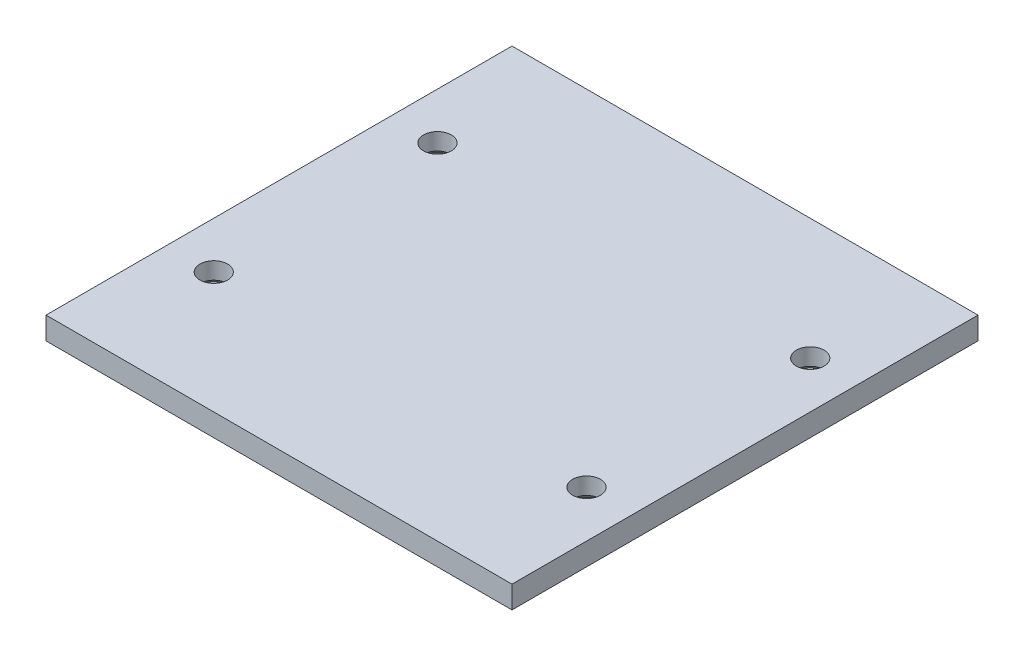
ISO-10303-21;
HEADER;
FILE_DESCRIPTION(('STEP AP214'),'2;1');
FILE_NAME('part.step','',(''),(''),'','','');
FILE_SCHEMA(('AUTOMOTIVE_DESIGN { 1 0 10303 214 1 1 1 1 }'));
ENDSEC;
DATA;
#1=APPLICATION_CONTEXT('core data for automotive mechanical design processes');
#2=APPLICATION_PROTOCOL_DEFINITION('international standard','automotive_design',2000,#1);
#3=PRODUCT_CONTEXT('',#1,'mechanical');
#4=PRODUCT('Part','Part','',(#3));
#5=PRODUCT_RELATED_PRODUCT_CATEGORY('part','',(#4));
#6=PRODUCT_DEFINITION_FORMATION('','',#4);
#7=PRODUCT_DEFINITION_CONTEXT('part definition',#1,'design');
#8=PRODUCT_DEFINITION('design','',#6,#7);
#9=PRODUCT_DEFINITION_SHAPE('','',#8);
#10=(LENGTH_UNIT() NAMED_UNIT(*) SI_UNIT(.MILLI.,.METRE.));
#11=(NAMED_UNIT(*) PLANE_ANGLE_UNIT() SI_UNIT($,.RADIAN.));
#12=(NAMED_UNIT(*) SI_UNIT($,.STERADIAN.) SOLID_ANGLE_UNIT());
#13=UNCERTAINTY_MEASURE_WITH_UNIT(LENGTH_MEASURE(1.E-05),#10,'distance_accuracy_value','');
#14=(GEOMETRIC_REPRESENTATION_CONTEXT(3) GLOBAL_UNCERTAINTY_ASSIGNED_CONTEXT((#13)) GLOBAL_UNIT_ASSIGNED_CONTEXT((#10,
#11,#12)) REPRESENTATION_CONTEXT('',''));
#15=CARTESIAN_POINT('',(0.,0.,0.));
#16=DIRECTION('',(0.,0.,1.));
#17=DIRECTION('',(1.,0.,0.));
#18=AXIS2_PLACEMENT_3D('',#15,#16,#17);
#19=CARTESIAN_POINT('',(0.,0.,0.));
#20=DIRECTION('',(0.,1.,0.));
#21=DIRECTION('',(0.,0.,1.));
#22=AXIS2_PLACEMENT_3D('',#19,#20,#21);
#23=PLANE('',#22);
#24=CARTESIAN_POINT('',(-49.9999999999994,0.,30.0000000000007));
#25=DIRECTION('',(0.,-1.,0.));
#26=DIRECTION('',(0.,0.,-1.));
#27=AXIS2_PLACEMENT_3D('',#24,#25,#26);
#28=CIRCLE('',#27,5.2);
#29=CARTESIAN_POINT('',(-49.9999999999994,0.,24.8000000000007));
#30=VERTEX_POINT('',#29);
#31=EDGE_CURVE('E135',#30,#30,#28,.T.);
#32=ORIENTED_EDGE('',*,*,#31,.F.);
#33=EDGE_LOOP('',(#32));
#34=FACE_BOUND('',#33,.T.);
#35=DIRECTION('',(0.,0.,1.));
#36=VECTOR('',#35,1.);
#37=CARTESIAN_POINT('',(-62.5,0.,-62.5));
#38=LINE('',#37,#36);
#39=CARTESIAN_POINT('',(-62.5,0.,-62.5));
#40=VERTEX_POINT('',#39);
#41=CARTESIAN_POINT('',(-62.5,0.,62.5));
#42=VERTEX_POINT('',#41);
#43=EDGE_CURVE('E112',#40,#42,#38,.T.);
#44=ORIENTED_EDGE('',*,*,#43,.F.);
#45=DIRECTION('',(-1.,0.,0.));
#46=VECTOR('',#45,1.);
#47=CARTESIAN_POINT('',(-62.5,0.,-62.5));
#48=LINE('',#47,#46);
#49=CARTESIAN_POINT('',(62.5,0.,-62.5));
#50=VERTEX_POINT('',#49);
#51=EDGE_CURVE('E82',#50,#40,#48,.T.);
#52=ORIENTED_EDGE('',*,*,#51,.F.);
#53=DIRECTION('',(0.,0.,-1.));
#54=VECTOR('',#53,1.);
#55=CARTESIAN_POINT('',(62.5,0.,-62.5));
#56=LINE('',#55,#54);
#57=CARTESIAN_POINT('',(62.5,0.,62.5));
#58=VERTEX_POINT('',#57);
#59=EDGE_CURVE('E76',#58,#50,#56,.T.);
#60=ORIENTED_EDGE('',*,*,#59,.F.);
#61=DIRECTION('',(1.,0.,0.));
#62=VECTOR('',#61,1.);
#63=CARTESIAN_POINT('',(-62.5,0.,62.5));
#64=LINE('',#63,#62);
#65=EDGE_CURVE('E100',#42,#58,#64,.T.);
#66=ORIENTED_EDGE('',*,*,#65,.F.);
#67=EDGE_LOOP('',(#44,#52,#60,#66));
#68=FACE_BOUND('',#67,.T.);
#69=CARTESIAN_POINT('',(50.,0.,-30.));
#70=DIRECTION('',(0.,-1.,0.));
#71=DIRECTION('',(0.,0.,-1.));
#72=AXIS2_PLACEMENT_3D('',#69,#70,#71);
#73=CIRCLE('',#72,5.2);
#74=CARTESIAN_POINT('',(50.,0.,-35.2));
#75=VERTEX_POINT('',#74);
#76=EDGE_CURVE('E130',#75,#75,#73,.T.);
#77=ORIENTED_EDGE('',*,*,#76,.F.);
#78=EDGE_LOOP('',(#77));
#79=FACE_BOUND('',#78,.T.);
#80=CARTESIAN_POINT('',(-50.,0.,-29.9999999999993));
#81=DIRECTION('',(0.,-1.,0.));
#82=DIRECTION('',(0.,0.,-1.));
#83=AXIS2_PLACEMENT_3D('',#80,#81,#82);
#84=CIRCLE('',#83,5.2);
#85=CARTESIAN_POINT('',(-50.,0.,-35.1999999999993));
#86=VERTEX_POINT('',#85);
#87=EDGE_CURVE('E131',#86,#86,#84,.T.);
#88=ORIENTED_EDGE('',*,*,#87,.F.);
#89=EDGE_LOOP('',(#88));
#90=FACE_BOUND('',#89,.T.);
#91=CARTESIAN_POINT('',(50.0000000000006,0.,30.));
#92=DIRECTION('',(0.,-1.,0.));
#93=DIRECTION('',(0.,0.,-1.));
#94=AXIS2_PLACEMENT_3D('',#91,#92,#93);
#95=CIRCLE('',#94,5.2);
#96=CARTESIAN_POINT('',(50.0000000000006,0.,24.8));
#97=VERTEX_POINT('',#96);
#98=EDGE_CURVE('E148',#97,#97,#95,.T.);
#99=ORIENTED_EDGE('',*,*,#98,.F.);
#100=EDGE_LOOP('',(#99));
#101=FACE_BOUND('',#100,.T.);
#102=ADVANCED_FACE('F39',(#34,#68,#79,#90,#101),#23,.F.);
#103=CARTESIAN_POINT('',(0.,6.,0.));
#104=DIRECTION('',(0.,1.,0.));
#105=DIRECTION('',(0.,0.,1.));
#106=AXIS2_PLACEMENT_3D('',#103,#104,#105);
#107=PLANE('',#106);
#108=CARTESIAN_POINT('',(-49.9999999999994,6.,30.0000000000007));
#109=DIRECTION('',(0.,1.,0.));
#110=DIRECTION('',(0.,0.,1.));
#111=AXIS2_PLACEMENT_3D('',#108,#109,#110);
#112=CIRCLE('',#111,3.72442885361654);
#113=CARTESIAN_POINT('',(-49.9999999999994,6.,33.7244288536172));
#114=VERTEX_POINT('',#113);
#115=EDGE_CURVE('E170',#114,#114,#112,.T.);
#116=ORIENTED_EDGE('',*,*,#115,.F.);
#117=EDGE_LOOP('',(#116));
#118=FACE_BOUND('',#117,.T.);
#119=CARTESIAN_POINT('',(-50.,6.,-29.9999999999993));
#120=DIRECTION('',(0.,1.,0.));
#121=DIRECTION('',(0.,0.,1.));
#122=AXIS2_PLACEMENT_3D('',#119,#120,#121);
#123=CIRCLE('',#122,3.72442885361654);
#124=CARTESIAN_POINT('',(-50.,6.,-26.2755711463828));
#125=VERTEX_POINT('',#124);
#126=EDGE_CURVE('E116',#125,#125,#123,.T.);
#127=ORIENTED_EDGE('',*,*,#126,.F.);
#128=EDGE_LOOP('',(#127));
#129=FACE_BOUND('',#128,.T.);
#130=DIRECTION('',(0.,0.,1.));
#131=VECTOR('',#130,1.);
#132=CARTESIAN_POINT('',(-62.5,6.,-62.5));
#133=LINE('',#132,#131);
#134=CARTESIAN_POINT('',(-62.5,6.,-62.5));
#135=VERTEX_POINT('',#134);
#136=CARTESIAN_POINT('',(-62.5,6.,62.5));
#137=VERTEX_POINT('',#136);
#138=EDGE_CURVE('E95',#135,#137,#133,.T.);
#139=ORIENTED_EDGE('',*,*,#138,.T.);
#140=DIRECTION('',(1.,0.,0.));
#141=VECTOR('',#140,1.);
#142=CARTESIAN_POINT('',(-62.5,6.,62.5));
#143=LINE('',#142,#141);
#144=CARTESIAN_POINT('',(62.5,6.,62.5));
#145=VERTEX_POINT('',#144);
#146=EDGE_CURVE('E89',#137,#145,#143,.T.);
#147=ORIENTED_EDGE('',*,*,#146,.T.);
#148=DIRECTION('',(0.,0.,-1.));
#149=VECTOR('',#148,1.);
#150=CARTESIAN_POINT('',(62.5,6.,-62.5));
#151=LINE('',#150,#149);
#152=CARTESIAN_POINT('',(62.5,6.,-62.5));
#153=VERTEX_POINT('',#152);
#154=EDGE_CURVE('E93',#145,#153,#151,.T.);
#155=ORIENTED_EDGE('',*,*,#154,.T.);
#156=DIRECTION('',(-1.,0.,0.));
#157=VECTOR('',#156,1.);
#158=CARTESIAN_POINT('',(-62.5,6.,-62.5));
#159=LINE('',#158,#157);
#160=EDGE_CURVE('E59',#153,#135,#159,.T.);
#161=ORIENTED_EDGE('',*,*,#160,.T.);
#162=EDGE_LOOP('',(#139,#147,#155,#161));
#163=FACE_BOUND('',#162,.T.);
#164=CARTESIAN_POINT('',(50.,6.,-30.));
#165=DIRECTION('',(0.,1.,0.));
#166=DIRECTION('',(0.,0.,1.));
#167=AXIS2_PLACEMENT_3D('',#164,#165,#166);
#168=CIRCLE('',#167,3.72442885361654);
#169=CARTESIAN_POINT('',(50.,6.,-26.2755711463835));
#170=VERTEX_POINT('',#169);
#171=EDGE_CURVE('E174',#170,#170,#168,.T.);
#172=ORIENTED_EDGE('',*,*,#171,.F.);
#173=EDGE_LOOP('',(#172));
#174=FACE_BOUND('',#173,.T.);
#175=CARTESIAN_POINT('',(50.0000000000006,6.,30.));
#176=DIRECTION('',(0.,1.,0.));
#177=DIRECTION('',(0.,0.,1.));
#178=AXIS2_PLACEMENT_3D('',#175,#176,#177);
#179=CIRCLE('',#178,3.72442885361654);
#180=CARTESIAN_POINT('',(50.0000000000006,6.,33.7244288536165));
#181=VERTEX_POINT('',#180);
#182=EDGE_CURVE('E163',#181,#181,#179,.T.);
#183=ORIENTED_EDGE('',*,*,#182,.F.);
#184=EDGE_LOOP('',(#183));
#185=FACE_BOUND('',#184,.T.);
#186=ADVANCED_FACE('F90',(#118,#129,#163,#174,#185),#107,.T.);
#187=CARTESIAN_POINT('',(-62.5,6.,-62.5));
#188=DIRECTION('',(1.,0.,0.));
#189=DIRECTION('',(0.,0.,-1.));
#190=AXIS2_PLACEMENT_3D('',#187,#188,#189);
#191=PLANE('',#190);
#192=ORIENTED_EDGE('',*,*,#43,.T.);
#193=DIRECTION('',(0.,-1.,0.));
#194=VECTOR('',#193,1.);
#195=CARTESIAN_POINT('',(-62.5,6.,62.5));
#196=LINE('',#195,#194);
#197=EDGE_CURVE('E11',#137,#42,#196,.T.);
#198=ORIENTED_EDGE('',*,*,#197,.F.);
#199=ORIENTED_EDGE('',*,*,#138,.F.);
#200=DIRECTION('',(0.,-1.,0.));
#201=VECTOR('',#200,1.);
#202=CARTESIAN_POINT('',(-62.5,6.,-62.5));
#203=LINE('',#202,#201);
#204=EDGE_CURVE('E108',#135,#40,#203,.T.);
#205=ORIENTED_EDGE('',*,*,#204,.T.);
#206=EDGE_LOOP('',(#192,#198,#199,#205));
#207=FACE_BOUND('',#206,.T.);
#208=ADVANCED_FACE('F41',(#207),#191,.F.);
#209=CARTESIAN_POINT('',(-62.5,6.,62.5));
#210=DIRECTION('',(0.,0.,-1.));
#211=DIRECTION('',(-1.,0.,0.));
#212=AXIS2_PLACEMENT_3D('',#209,#210,#211);
#213=PLANE('',#212);
#214=ORIENTED_EDGE('',*,*,#65,.T.);
#215=DIRECTION('',(0.,-1.,0.));
#216=VECTOR('',#215,1.);
#217=CARTESIAN_POINT('',(62.5,6.,62.5));
#218=LINE('',#217,#216);
#219=EDGE_CURVE('E50',#145,#58,#218,.T.);
#220=ORIENTED_EDGE('',*,*,#219,.F.);
#221=ORIENTED_EDGE('',*,*,#146,.F.);
#222=ORIENTED_EDGE('',*,*,#197,.T.);
#223=EDGE_LOOP('',(#214,#220,#221,#222));
#224=FACE_BOUND('',#223,.T.);
#225=ADVANCED_FACE('F99',(#224),#213,.F.);
#226=CARTESIAN_POINT('',(62.5,6.,-62.5));
#227=DIRECTION('',(-1.,0.,0.));
#228=DIRECTION('',(0.,0.,1.));
#229=AXIS2_PLACEMENT_3D('',#226,#227,#228);
#230=PLANE('',#229);
#231=ORIENTED_EDGE('',*,*,#59,.T.);
#232=DIRECTION('',(0.,-1.,0.));
#233=VECTOR('',#232,1.);
#234=CARTESIAN_POINT('',(62.5,6.,-62.5));
#235=LINE('',#234,#233);
#236=EDGE_CURVE('E102',#153,#50,#235,.T.);
#237=ORIENTED_EDGE('',*,*,#236,.F.);
#238=ORIENTED_EDGE('',*,*,#154,.F.);
#239=ORIENTED_EDGE('',*,*,#219,.T.);
#240=EDGE_LOOP('',(#231,#237,#238,#239));
#241=FACE_BOUND('',#240,.T.);
#242=ADVANCED_FACE('F104',(#241),#230,.F.);
#243=CARTESIAN_POINT('',(-62.5,6.,-62.5));
#244=DIRECTION('',(0.,0.,1.));
#245=DIRECTION('',(1.,0.,0.));
#246=AXIS2_PLACEMENT_3D('',#243,#244,#245);
#247=PLANE('',#246);
#248=CARTESIAN_POINT('',(-0.738370199421468,3.,-62.5));
#249=DIRECTION('',(0.,0.,-1.));
#250=DIRECTION('',(-1.,0.,0.));
#251=AXIS2_PLACEMENT_3D('',#248,#249,#250);
#252=CIRCLE('',#251,2.);
#253=CARTESIAN_POINT('',(-2.73837019942147,3.,-62.5));
#254=VERTEX_POINT('',#253);
#255=EDGE_CURVE('E158',#254,#254,#252,.T.);
#256=ORIENTED_EDGE('',*,*,#255,.F.);
#257=EDGE_LOOP('',(#256));
#258=FACE_BOUND('',#257,.T.);
#259=ORIENTED_EDGE('',*,*,#51,.T.);
#260=ORIENTED_EDGE('',*,*,#204,.F.);
#261=ORIENTED_EDGE('',*,*,#160,.F.);
#262=ORIENTED_EDGE('',*,*,#236,.T.);
#263=EDGE_LOOP('',(#259,#260,#261,#262));
#264=FACE_BOUND('',#263,.T.);
#265=ADVANCED_FACE('F199',(#258,#264),#247,.F.);
#266=CARTESIAN_POINT('',(-50.,6.,-29.9999999999993));
#267=DIRECTION('',(0.,-1.,0.));
#268=DIRECTION('',(0.,0.,-1.));
#269=AXIS2_PLACEMENT_3D('',#266,#267,#268);
#270=CYLINDRICAL_SURFACE('',#269,3.72442885361654);
#271=CARTESIAN_POINT('',(-50.,1.47557114638346,-29.9999999999993));
#272=DIRECTION('',(0.,-1.,0.));
#273=DIRECTION('',(0.,0.,-1.));
#274=AXIS2_PLACEMENT_3D('',#271,#272,#273);
#275=CIRCLE('',#274,3.72442885361654);
#276=CARTESIAN_POINT('',(-50.,1.47557114638346,-33.7244288536158));
#277=VERTEX_POINT('',#276);
#278=EDGE_CURVE('E127',#277,#277,#275,.F.);
#279=ORIENTED_EDGE('',*,*,#278,.F.);
#280=EDGE_LOOP('',(#279));
#281=FACE_BOUND('',#280,.T.);
#282=ORIENTED_EDGE('',*,*,#126,.T.);
#283=EDGE_LOOP('',(#282));
#284=FACE_BOUND('',#283,.T.);
#285=ADVANCED_FACE('F183',(#281,#284),#270,.F.);
#286=CARTESIAN_POINT('',(50.,6.,-30.));
#287=DIRECTION('',(0.,-1.,0.));
#288=DIRECTION('',(0.,0.,-1.));
#289=AXIS2_PLACEMENT_3D('',#286,#287,#288);
#290=CYLINDRICAL_SURFACE('',#289,3.72442885361654);
#291=CARTESIAN_POINT('',(50.,1.47557114638346,-30.));
#292=DIRECTION('',(0.,-1.,0.));
#293=DIRECTION('',(0.,0.,-1.));
#294=AXIS2_PLACEMENT_3D('',#291,#292,#293);
#295=CIRCLE('',#294,3.72442885361654);
#296=CARTESIAN_POINT('',(50.,1.47557114638346,-33.7244288536165));
#297=VERTEX_POINT('',#296);
#298=EDGE_CURVE('E154',#297,#297,#295,.F.);
#299=ORIENTED_EDGE('',*,*,#298,.F.);
#300=EDGE_LOOP('',(#299));
#301=FACE_BOUND('',#300,.T.);
#302=ORIENTED_EDGE('',*,*,#171,.T.);
#303=EDGE_LOOP('',(#302));
#304=FACE_BOUND('',#303,.T.);
#305=ADVANCED_FACE('F224',(#301,#304),#290,.F.);
#306=CARTESIAN_POINT('',(-49.9999999999994,6.,30.0000000000007));
#307=DIRECTION('',(0.,-1.,0.));
#308=DIRECTION('',(0.,0.,-1.));
#309=AXIS2_PLACEMENT_3D('',#306,#307,#308);
#310=CYLINDRICAL_SURFACE('',#309,3.72442885361654);
#311=CARTESIAN_POINT('',(-49.9999999999994,1.47557114638346,30.0000000000007));
#312=DIRECTION('',(0.,-1.,0.));
#313=DIRECTION('',(0.,0.,-1.));
#314=AXIS2_PLACEMENT_3D('',#311,#312,#313);
#315=CIRCLE('',#314,3.72442885361654);
#316=CARTESIAN_POINT('',(-49.9999999999994,1.47557114638346,26.2755711463842));
#317=VERTEX_POINT('',#316);
#318=EDGE_CURVE('E132',#317,#317,#315,.F.);
#319=ORIENTED_EDGE('',*,*,#318,.F.);
#320=EDGE_LOOP('',(#319));
#321=FACE_BOUND('',#320,.T.);
#322=ORIENTED_EDGE('',*,*,#115,.T.);
#323=EDGE_LOOP('',(#322));
#324=FACE_BOUND('',#323,.T.);
#325=ADVANCED_FACE('F233',(#321,#324),#310,.F.);
#326=CARTESIAN_POINT('',(50.0000000000006,6.,30.));
#327=DIRECTION('',(0.,-1.,0.));
#328=DIRECTION('',(0.,0.,-1.));
#329=AXIS2_PLACEMENT_3D('',#326,#327,#328);
#330=CYLINDRICAL_SURFACE('',#329,3.72442885361654);
#331=CARTESIAN_POINT('',(50.0000000000006,1.47557114638346,30.));
#332=DIRECTION('',(0.,-1.,0.));
#333=DIRECTION('',(0.,0.,-1.));
#334=AXIS2_PLACEMENT_3D('',#331,#332,#333);
#335=CIRCLE('',#334,3.72442885361654);
#336=CARTESIAN_POINT('',(50.0000000000006,1.47557114638346,26.2755711463835));
#337=VERTEX_POINT('',#336);
#338=EDGE_CURVE('E43',#337,#337,#335,.F.);
#339=ORIENTED_EDGE('',*,*,#338,.F.);
#340=EDGE_LOOP('',(#339));
#341=FACE_BOUND('',#340,.T.);
#342=ORIENTED_EDGE('',*,*,#182,.T.);
#343=EDGE_LOOP('',(#342));
#344=FACE_BOUND('',#343,.T.);
#345=ADVANCED_FACE('F241',(#341,#344),#330,.F.);
#346=CARTESIAN_POINT('',(-0.738370199421468,3.,-57.5));
#347=DIRECTION('',(0.,0.,-1.));
#348=DIRECTION('',(-1.,0.,0.));
#349=AXIS2_PLACEMENT_3D('',#346,#347,#348);
#350=CYLINDRICAL_SURFACE('',#349,2.);
#351=CARTESIAN_POINT('',(-0.738370199421468,3.,-57.5));
#352=DIRECTION('',(0.,0.,-1.));
#353=DIRECTION('',(-1.,0.,0.));
#354=AXIS2_PLACEMENT_3D('',#351,#352,#353);
#355=CIRCLE('',#354,2.);
#356=CARTESIAN_POINT('',(-2.73837019942147,3.,-57.5));
#357=VERTEX_POINT('',#356);
#358=EDGE_CURVE('E159',#357,#357,#355,.T.);
#359=ORIENTED_EDGE('',*,*,#358,.F.);
#360=EDGE_LOOP('',(#359));
#361=FACE_BOUND('',#360,.T.);
#362=ORIENTED_EDGE('',*,*,#255,.T.);
#363=EDGE_LOOP('',(#362));
#364=FACE_BOUND('',#363,.T.);
#365=ADVANCED_FACE('F250',(#361,#364),#350,.F.);
#366=CARTESIAN_POINT('',(-0.738370199421468,3.,-57.5));
#367=DIRECTION('',(0.,0.,-1.));
#368=DIRECTION('',(-1.,0.,0.));
#369=AXIS2_PLACEMENT_3D('',#366,#367,#368);
#370=PLANE('',#369);
#371=ORIENTED_EDGE('',*,*,#358,.T.);
#372=EDGE_LOOP('',(#371));
#373=FACE_BOUND('',#372,.T.);
#374=ADVANCED_FACE('F259',(#373),#370,.T.);
#375=CARTESIAN_POINT('',(50.,0.,-30.));
#376=DIRECTION('',(0.,-1.,0.));
#377=DIRECTION('',(0.,0.,-1.));
#378=AXIS2_PLACEMENT_3D('',#375,#376,#377);
#379=CONICAL_SURFACE('',#378,5.2,0.785398163397447);
#380=ORIENTED_EDGE('',*,*,#298,.T.);
#381=EDGE_LOOP('',(#380));
#382=FACE_BOUND('',#381,.T.);
#383=ORIENTED_EDGE('',*,*,#76,.T.);
#384=EDGE_LOOP('',(#383));
#385=FACE_BOUND('',#384,.T.);
#386=ADVANCED_FACE('F266',(#382,#385),#379,.F.);
#387=CARTESIAN_POINT('',(-50.,0.,-29.9999999999993));
#388=DIRECTION('',(0.,-1.,0.));
#389=DIRECTION('',(0.,0.,-1.));
#390=AXIS2_PLACEMENT_3D('',#387,#388,#389);
#391=CONICAL_SURFACE('',#390,5.2,0.785398163397448);
#392=ORIENTED_EDGE('',*,*,#278,.T.);
#393=EDGE_LOOP('',(#392));
#394=FACE_BOUND('',#393,.T.);
#395=ORIENTED_EDGE('',*,*,#87,.T.);
#396=EDGE_LOOP('',(#395));
#397=FACE_BOUND('',#396,.T.);
#398=ADVANCED_FACE('F273',(#394,#397),#391,.F.);
#399=CARTESIAN_POINT('',(-49.9999999999994,0.,30.0000000000007));
#400=DIRECTION('',(0.,-1.,0.));
#401=DIRECTION('',(0.,0.,-1.));
#402=AXIS2_PLACEMENT_3D('',#399,#400,#401);
#403=CONICAL_SURFACE('',#402,5.2,0.785398163397448);
#404=ORIENTED_EDGE('',*,*,#318,.T.);
#405=EDGE_LOOP('',(#404));
#406=FACE_BOUND('',#405,.T.);
#407=ORIENTED_EDGE('',*,*,#31,.T.);
#408=EDGE_LOOP('',(#407));
#409=FACE_BOUND('',#408,.T.);
#410=ADVANCED_FACE('F280',(#406,#409),#403,.F.);
#411=CARTESIAN_POINT('',(50.0000000000006,0.,30.));
#412=DIRECTION('',(0.,-1.,0.));
#413=DIRECTION('',(0.,0.,-1.));
#414=AXIS2_PLACEMENT_3D('',#411,#412,#413);
#415=CONICAL_SURFACE('',#414,5.2,0.785398163397449);
#416=ORIENTED_EDGE('',*,*,#338,.T.);
#417=EDGE_LOOP('',(#416));
#418=FACE_BOUND('',#417,.T.);
#419=ORIENTED_EDGE('',*,*,#98,.T.);
#420=EDGE_LOOP('',(#419));
#421=FACE_BOUND('',#420,.T.);
#422=ADVANCED_FACE('F287',(#418,#421),#415,.F.);
#423=CLOSED_SHELL('',(#102,#186,#208,#225,#242,#265,#285,#305,#325,#345,#365,#374,#386,#398,
#410,#422));
#424=MANIFOLD_SOLID_BREP('B2',#423);
#425=ADVANCED_BREP_SHAPE_REPRESENTATION('',(#18,#424),#14);
#426=SHAPE_DEFINITION_REPRESENTATION(#9,#425);
ENDSEC;
END-ISO-10303-21;
